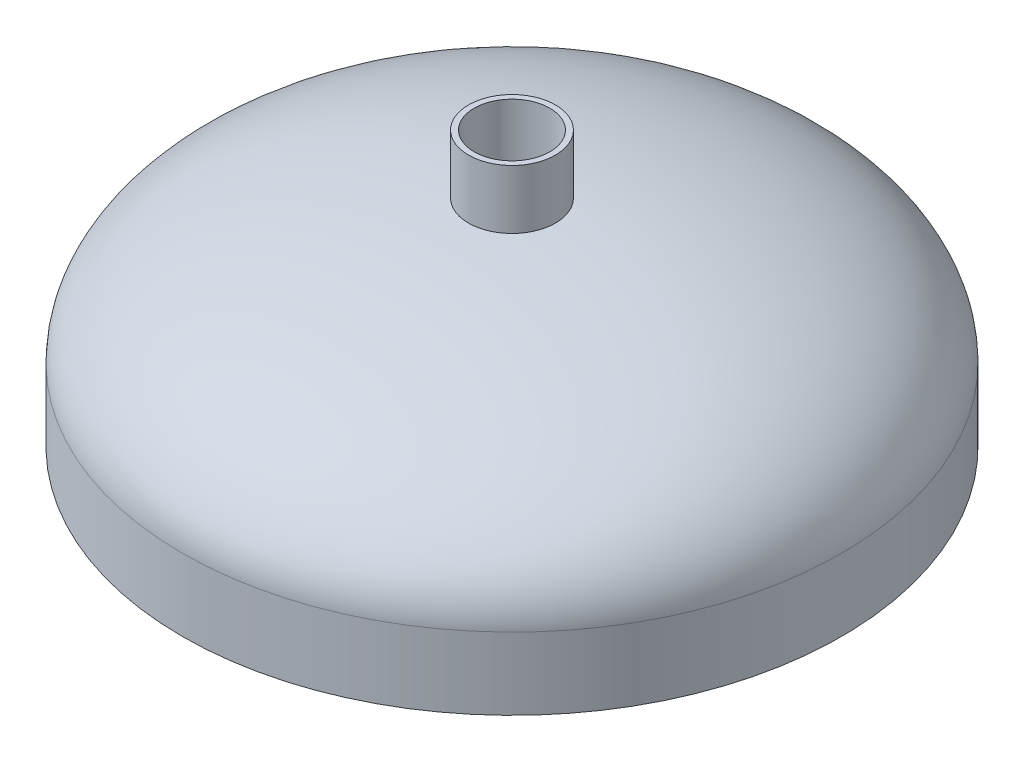
ISO-10303-21;
HEADER;
FILE_DESCRIPTION(('STEP AP214'),'2;1');
FILE_NAME('part.step','',(''),(''),'','','');
FILE_SCHEMA(('AUTOMOTIVE_DESIGN { 1 0 10303 214 1 1 1 1 }'));
ENDSEC;
DATA;
#1=APPLICATION_CONTEXT('core data for automotive mechanical design processes');
#2=APPLICATION_PROTOCOL_DEFINITION('international standard','automotive_design',2000,#1);
#3=PRODUCT_CONTEXT('',#1,'mechanical');
#4=PRODUCT('Part','Part','',(#3));
#5=PRODUCT_RELATED_PRODUCT_CATEGORY('part','',(#4));
#6=PRODUCT_DEFINITION_FORMATION('','',#4);
#7=PRODUCT_DEFINITION_CONTEXT('part definition',#1,'design');
#8=PRODUCT_DEFINITION('design','',#6,#7);
#9=PRODUCT_DEFINITION_SHAPE('','',#8);
#10=(LENGTH_UNIT() NAMED_UNIT(*) SI_UNIT(.MILLI.,.METRE.));
#11=(NAMED_UNIT(*) PLANE_ANGLE_UNIT() SI_UNIT($,.RADIAN.));
#12=(NAMED_UNIT(*) SI_UNIT($,.STERADIAN.) SOLID_ANGLE_UNIT());
#13=UNCERTAINTY_MEASURE_WITH_UNIT(LENGTH_MEASURE(1.E-05),#10,'distance_accuracy_value','');
#14=(GEOMETRIC_REPRESENTATION_CONTEXT(3) GLOBAL_UNCERTAINTY_ASSIGNED_CONTEXT((#13)) GLOBAL_UNIT_ASSIGNED_CONTEXT((#10,
#11,#12)) REPRESENTATION_CONTEXT('',''));
#15=CARTESIAN_POINT('',(0.,0.,0.));
#16=DIRECTION('',(0.,0.,1.));
#17=DIRECTION('',(1.,0.,0.));
#18=AXIS2_PLACEMENT_3D('',#15,#16,#17);
#19=CARTESIAN_POINT('',(0.,50.,0.));
#20=DIRECTION('',(0.,-1.,0.));
#21=DIRECTION('',(0.,0.,-1.));
#22=AXIS2_PLACEMENT_3D('',#19,#20,#21);
#23=CYLINDRICAL_SURFACE('',#22,228.6);
#24=CARTESIAN_POINT('',(0.,50.,0.));
#25=DIRECTION('',(0.,1.,0.));
#26=DIRECTION('',(0.,0.,1.));
#27=AXIS2_PLACEMENT_3D('',#24,#25,#26);
#28=CIRCLE('',#27,228.6);
#29=CARTESIAN_POINT('',(0.,50.,228.6));
#30=VERTEX_POINT('',#29);
#31=EDGE_CURVE('E45',#30,#30,#28,.T.);
#32=ORIENTED_EDGE('',*,*,#31,.F.);
#33=EDGE_LOOP('',(#32));
#34=FACE_BOUND('',#33,.T.);
#35=CARTESIAN_POINT('',(0.,0.,0.));
#36=DIRECTION('',(0.,1.,0.));
#37=DIRECTION('',(0.,0.,1.));
#38=AXIS2_PLACEMENT_3D('',#35,#36,#37);
#39=CIRCLE('',#38,228.6);
#40=CARTESIAN_POINT('',(0.,0.,228.6));
#41=VERTEX_POINT('',#40);
#42=EDGE_CURVE('E50',#41,#41,#39,.T.);
#43=ORIENTED_EDGE('',*,*,#42,.T.);
#44=EDGE_LOOP('',(#43));
#45=FACE_BOUND('',#44,.T.);
#46=ADVANCED_FACE('F37',(#34,#45),#23,.T.);
#47=CARTESIAN_POINT('',(0.,50.,0.));
#48=DIRECTION('',(1.,0.,0.));
#49=DIRECTION('',(0.,0.,1.));
#50=AXIS2_PLACEMENT_3D('',#47,#48,#49);
#51=ELLIPSE('',#50,228.6,100.);
#52=TRIMMED_CURVE('',#51,(PARAMETER_VALUE(4.71238898038469)),
(PARAMETER_VALUE(7.85398163397448)),.T.,.PARAMETER.);
#53=CARTESIAN_POINT('',(0.,-50.,0.));
#54=DIRECTION('',(0.,1.,0.));
#55=AXIS1_PLACEMENT('',#53,#54);
#56=SURFACE_OF_REVOLUTION('',#52,#55);
#57=CARTESIAN_POINT('',(0.,149.126438966109,0.));
#58=DIRECTION('',(0.,1.,0.));
#59=DIRECTION('',(0.,0.,1.));
#60=AXIS2_PLACEMENT_3D('',#57,#58,#59);
#61=CIRCLE('',#60,30.15);
#62=CARTESIAN_POINT('',(0.,149.126438966109,30.15));
#63=VERTEX_POINT('',#62);
#64=EDGE_CURVE('E10',#63,#63,#61,.T.);
#65=ORIENTED_EDGE('',*,*,#64,.F.);
#66=EDGE_LOOP('',(#65));
#67=FACE_BOUND('',#66,.T.);
#68=ORIENTED_EDGE('',*,*,#31,.T.);
#69=EDGE_LOOP('',(#68));
#70=FACE_BOUND('',#69,.T.);
#71=ADVANCED_FACE('F39',(#67,#70),#56,.F.);
#72=CARTESIAN_POINT('',(0.,0.,0.));
#73=DIRECTION('',(0.,1.,0.));
#74=DIRECTION('',(0.,0.,1.));
#75=AXIS2_PLACEMENT_3D('',#72,#73,#74);
#76=PLANE('',#75);
#77=CARTESIAN_POINT('',(0.,0.,0.));
#78=DIRECTION('',(0.,1.,0.));
#79=DIRECTION('',(0.,0.,1.));
#80=AXIS2_PLACEMENT_3D('',#77,#78,#79);
#81=CIRCLE('',#80,219.075);
#82=CARTESIAN_POINT('',(0.,0.,219.075));
#83=VERTEX_POINT('',#82);
#84=EDGE_CURVE('E59',#83,#83,#81,.T.);
#85=ORIENTED_EDGE('',*,*,#84,.T.);
#86=EDGE_LOOP('',(#85));
#87=FACE_BOUND('',#86,.T.);
#88=ORIENTED_EDGE('',*,*,#42,.F.);
#89=EDGE_LOOP('',(#88));
#90=FACE_BOUND('',#89,.T.);
#91=ADVANCED_FACE('F70',(#87,#90),#76,.F.);
#92=CARTESIAN_POINT('',(0.,50.,0.));
#93=DIRECTION('',(0.,-1.,0.));
#94=DIRECTION('',(0.,0.,-1.));
#95=AXIS2_PLACEMENT_3D('',#92,#93,#94);
#96=CYLINDRICAL_SURFACE('',#95,219.075);
#97=CARTESIAN_POINT('',(0.,50.,0.));
#98=DIRECTION('',(0.,1.,0.));
#99=DIRECTION('',(0.,0.,1.));
#100=AXIS2_PLACEMENT_3D('',#97,#98,#99);
#101=CIRCLE('',#100,219.075);
#102=CARTESIAN_POINT('',(0.,50.,219.075));
#103=VERTEX_POINT('',#102);
#104=EDGE_CURVE('E56',#103,#103,#101,.T.);
#105=ORIENTED_EDGE('',*,*,#104,.T.);
#106=EDGE_LOOP('',(#105));
#107=FACE_BOUND('',#106,.T.);
#108=ORIENTED_EDGE('',*,*,#84,.F.);
#109=EDGE_LOOP('',(#108));
#110=FACE_BOUND('',#109,.T.);
#111=ADVANCED_FACE('F72',(#107,#110),#96,.F.);
#112=CARTESIAN_POINT('',(0.,50.,0.));
#113=DIRECTION('',(1.,0.,0.));
#114=DIRECTION('',(0.,0.,1.));
#115=AXIS2_PLACEMENT_3D('',#112,#113,#114);
#116=ELLIPSE('',#115,228.6,100.);
#117=TRIMMED_CURVE('',#116,(PARAMETER_VALUE(4.71238898038469)),
(PARAMETER_VALUE(7.85398163397448)),.T.,.PARAMETER.);
#118=CARTESIAN_POINT('',(0.,-50.,0.));
#119=DIRECTION('',(0.,1.,0.));
#120=AXIS1_PLACEMENT('',#118,#119);
#121=SURFACE_OF_REVOLUTION('',#117,#120);
#122=OFFSET_SURFACE('',#121,9.525,.F.);
#123=CARTESIAN_POINT('',(0.,139.585012516354,0.));
#124=DIRECTION('',(0.,1.,0.));
#125=DIRECTION('',(0.,0.,1.));
#126=AXIS2_PLACEMENT_3D('',#123,#124,#125);
#127=CIRCLE('',#126,30.15);
#128=CARTESIAN_POINT('',(0.,139.585012516354,30.15));
#129=VERTEX_POINT('',#128);
#130=EDGE_CURVE('E42',#129,#129,#127,.T.);
#131=ORIENTED_EDGE('',*,*,#130,.T.);
#132=EDGE_LOOP('',(#131));
#133=FACE_BOUND('',#132,.T.);
#134=ORIENTED_EDGE('',*,*,#104,.F.);
#135=EDGE_LOOP('',(#134));
#136=FACE_BOUND('',#135,.T.);
#137=ADVANCED_FACE('F68',(#133,#136),#122,.T.);
#138=CARTESIAN_POINT('',(0.,130.,0.));
#139=DIRECTION('',(0.,1.,0.));
#140=DIRECTION('',(0.,0.,1.));
#141=AXIS2_PLACEMENT_3D('',#138,#139,#140);
#142=PLANE('',#141);
#143=CARTESIAN_POINT('',(0.,130.,0.));
#144=DIRECTION('',(0.,1.,0.));
#145=DIRECTION('',(0.,0.,1.));
#146=AXIS2_PLACEMENT_3D('',#143,#144,#145);
#147=CIRCLE('',#146,26.24);
#148=CARTESIAN_POINT('',(0.,130.,26.24));
#149=VERTEX_POINT('',#148);
#150=EDGE_CURVE('E176',#149,#149,#147,.F.);
#151=ORIENTED_EDGE('',*,*,#150,.F.);
#152=EDGE_LOOP('',(#151));
#153=FACE_BOUND('',#152,.T.);
#154=CARTESIAN_POINT('',(0.,130.,0.));
#155=DIRECTION('',(0.,1.,0.));
#156=DIRECTION('',(0.,0.,1.));
#157=AXIS2_PLACEMENT_3D('',#154,#155,#156);
#158=CIRCLE('',#157,30.15);
#159=CARTESIAN_POINT('',(0.,130.,30.15));
#160=VERTEX_POINT('',#159);
#161=EDGE_CURVE('E179',#160,#160,#158,.T.);
#162=ORIENTED_EDGE('',*,*,#161,.F.);
#163=EDGE_LOOP('',(#162));
#164=FACE_BOUND('',#163,.T.);
#165=ADVANCED_FACE('F99',(#153,#164),#142,.F.);
#166=CARTESIAN_POINT('',(0.,130.,0.));
#167=DIRECTION('',(0.,1.,0.));
#168=DIRECTION('',(0.,0.,1.));
#169=AXIS2_PLACEMENT_3D('',#166,#167,#168);
#170=CYLINDRICAL_SURFACE('',#169,30.15);
#171=ORIENTED_EDGE('',*,*,#161,.T.);
#172=EDGE_LOOP('',(#171));
#173=FACE_BOUND('',#172,.T.);
#174=ORIENTED_EDGE('',*,*,#130,.F.);
#175=EDGE_LOOP('',(#174));
#176=FACE_BOUND('',#175,.T.);
#177=ADVANCED_FACE('F105',(#173,#176),#170,.T.);
#178=ORIENTED_EDGE('',*,*,#64,.T.);
#179=EDGE_LOOP('',(#178));
#180=FACE_BOUND('',#179,.T.);
#181=CARTESIAN_POINT('',(0.,190.,0.));
#182=DIRECTION('',(0.,1.,0.));
#183=DIRECTION('',(0.,0.,1.));
#184=AXIS2_PLACEMENT_3D('',#181,#182,#183);
#185=CIRCLE('',#184,30.15);
#186=CARTESIAN_POINT('',(0.,190.,30.15));
#187=VERTEX_POINT('',#186);
#188=EDGE_CURVE('E54',#187,#187,#185,.T.);
#189=ORIENTED_EDGE('',*,*,#188,.F.);
#190=EDGE_LOOP('',(#189));
#191=FACE_BOUND('',#190,.T.);
#192=ADVANCED_FACE('F109',(#180,#191),#170,.T.);
#193=CARTESIAN_POINT('',(0.,190.,0.));
#194=DIRECTION('',(0.,1.,0.));
#195=DIRECTION('',(0.,0.,1.));
#196=AXIS2_PLACEMENT_3D('',#193,#194,#195);
#197=PLANE('',#196);
#198=CARTESIAN_POINT('',(0.,190.,0.));
#199=DIRECTION('',(0.,1.,0.));
#200=DIRECTION('',(0.,0.,1.));
#201=AXIS2_PLACEMENT_3D('',#198,#199,#200);
#202=CIRCLE('',#201,26.24);
#203=CARTESIAN_POINT('',(0.,190.,26.24));
#204=VERTEX_POINT('',#203);
#205=EDGE_CURVE('E173',#204,#204,#202,.T.);
#206=ORIENTED_EDGE('',*,*,#205,.F.);
#207=EDGE_LOOP('',(#206));
#208=FACE_BOUND('',#207,.T.);
#209=ORIENTED_EDGE('',*,*,#188,.T.);
#210=EDGE_LOOP('',(#209));
#211=FACE_BOUND('',#210,.T.);
#212=ADVANCED_FACE('F118',(#208,#211),#197,.T.);
#213=CARTESIAN_POINT('',(0.,-0.001000000000001,0.));
#214=DIRECTION('',(0.,1.,0.));
#215=DIRECTION('',(0.,0.,1.));
#216=AXIS2_PLACEMENT_3D('',#213,#214,#215);
#217=CYLINDRICAL_SURFACE('',#216,26.24);
#218=CARTESIAN_POINT('',(0.,190.,26.24));
#219=CARTESIAN_POINT('',(0.,189.375,26.24));
#220=CARTESIAN_POINT('',(0.,188.75,26.24));
#221=CARTESIAN_POINT('',(0.,187.5,26.24));
#222=CARTESIAN_POINT('',(0.,186.875,26.24));
#223=CARTESIAN_POINT('',(0.,185.625,26.24));
#224=CARTESIAN_POINT('',(0.,185.,26.24));
#225=CARTESIAN_POINT('',(0.,183.75,26.24));
#226=CARTESIAN_POINT('',(0.,183.125,26.24));
#227=CARTESIAN_POINT('',(0.,181.875,26.24));
#228=CARTESIAN_POINT('',(0.,181.25,26.24));
#229=CARTESIAN_POINT('',(0.,180.,26.24));
#230=CARTESIAN_POINT('',(0.,179.375,26.24));
#231=CARTESIAN_POINT('',(0.,178.125,26.24));
#232=CARTESIAN_POINT('',(0.,177.5,26.24));
#233=CARTESIAN_POINT('',(0.,176.25,26.24));
#234=CARTESIAN_POINT('',(0.,175.625,26.24));
#235=CARTESIAN_POINT('',(0.,174.375,26.24));
#236=CARTESIAN_POINT('',(0.,173.75,26.24));
#237=CARTESIAN_POINT('',(0.,172.5,26.24));
#238=CARTESIAN_POINT('',(0.,171.875,26.24));
#239=CARTESIAN_POINT('',(0.,170.625,26.24));
#240=CARTESIAN_POINT('',(0.,170.,26.24));
#241=CARTESIAN_POINT('',(0.,168.75,26.24));
#242=CARTESIAN_POINT('',(0.,168.125,26.24));
#243=CARTESIAN_POINT('',(0.,166.875,26.24));
#244=CARTESIAN_POINT('',(0.,166.25,26.24));
#245=CARTESIAN_POINT('',(0.,165.,26.24));
#246=CARTESIAN_POINT('',(0.,164.375,26.24));
#247=CARTESIAN_POINT('',(0.,163.125,26.24));
#248=CARTESIAN_POINT('',(0.,162.5,26.24));
#249=CARTESIAN_POINT('',(0.,161.25,26.24));
#250=CARTESIAN_POINT('',(0.,160.625,26.24));
#251=CARTESIAN_POINT('',(0.,159.375,26.24));
#252=CARTESIAN_POINT('',(0.,158.75,26.24));
#253=CARTESIAN_POINT('',(0.,157.5,26.24));
#254=CARTESIAN_POINT('',(0.,156.875,26.24));
#255=CARTESIAN_POINT('',(0.,155.625,26.24));
#256=CARTESIAN_POINT('',(0.,155.,26.24));
#257=CARTESIAN_POINT('',(0.,153.75,26.24));
#258=CARTESIAN_POINT('',(0.,153.125,26.24));
#259=CARTESIAN_POINT('',(0.,151.875,26.24));
#260=CARTESIAN_POINT('',(0.,151.25,26.24));
#261=CARTESIAN_POINT('',(0.,150.,26.24));
#262=CARTESIAN_POINT('',(0.,149.375,26.24));
#263=CARTESIAN_POINT('',(0.,148.125,26.24));
#264=CARTESIAN_POINT('',(0.,147.5,26.24));
#265=CARTESIAN_POINT('',(0.,146.25,26.24));
#266=CARTESIAN_POINT('',(0.,145.625,26.24));
#267=CARTESIAN_POINT('',(0.,144.375,26.24));
#268=CARTESIAN_POINT('',(0.,143.75,26.24));
#269=CARTESIAN_POINT('',(0.,142.5,26.24));
#270=CARTESIAN_POINT('',(0.,141.875,26.24));
#271=CARTESIAN_POINT('',(0.,140.625,26.24));
#272=CARTESIAN_POINT('',(0.,140.,26.24));
#273=CARTESIAN_POINT('',(0.,138.75,26.24));
#274=CARTESIAN_POINT('',(0.,138.125,26.24));
#275=CARTESIAN_POINT('',(0.,136.875,26.24));
#276=CARTESIAN_POINT('',(0.,136.25,26.24));
#277=CARTESIAN_POINT('',(0.,135.,26.24));
#278=CARTESIAN_POINT('',(0.,134.375,26.24));
#279=CARTESIAN_POINT('',(0.,133.125,26.24));
#280=CARTESIAN_POINT('',(0.,132.5,26.24));
#281=CARTESIAN_POINT('',(0.,131.25,26.24));
#282=CARTESIAN_POINT('',(0.,130.625,26.24));
#283=CARTESIAN_POINT('',(0.,130.,26.24));
#284=B_SPLINE_CURVE_WITH_KNOTS('',3,(#218,#219,#220,#221,#222,#223,#224,#225,#226,#227,#228,
#229,#230,#231,#232,#233,#234,#235,#236,#237,#238,#239,#240,#241,#242,#243,#244,#245,#246,#247,
#248,#249,#250,#251,#252,#253,#254,#255,#256,#257,#258,#259,#260,#261,#262,#263,#264,#265,#266,
#267,#268,#269,#270,#271,#272,#273,#274,#275,#276,#277,#278,#279,#280,#281,#282,#283),
.UNSPECIFIED.,.F.,.F.,(4,2,2,2,2,2,2,2,2,2,2,2,2,2,2,2,2,2,2,2,2,2,2,2,2,2,2,2,2,2,2,2,4),(0.,
1.87499999999999,3.75,5.62499999999999,7.50000000000001,9.37499999999999,11.25,13.125,15.,
16.875,18.75,20.625,22.5,24.375,26.25,28.125,30.,31.875,33.75,35.625,37.5,39.375,41.25,43.125,
45.,46.875,48.75,50.625,52.5,54.375,56.25,58.125,60.),.UNSPECIFIED.);
#285=EDGE_CURVE('BSEAM132',#204,#149,#284,.T.);
#286=ORIENTED_EDGE('',*,*,#205,.T.);
#287=ORIENTED_EDGE('',*,*,#150,.T.);
#288=ORIENTED_EDGE('',*,*,#285,.T.);
#289=ORIENTED_EDGE('',*,*,#285,.F.);
#290=EDGE_LOOP('',(#286,#288,#287,#289));
#291=FACE_BOUND('',#290,.T.);
#292=ADVANCED_FACE('F132',(#291),#217,.F.);
#293=CLOSED_SHELL('',(#46,#71,#91,#111,#137,#165,#177,#192,#212,#292));
#294=MANIFOLD_SOLID_BREP('B2',#293);
#295=ADVANCED_BREP_SHAPE_REPRESENTATION('',(#18,#294),#14);
#296=SHAPE_DEFINITION_REPRESENTATION(#9,#295);
ENDSEC;
END-ISO-10303-21;
